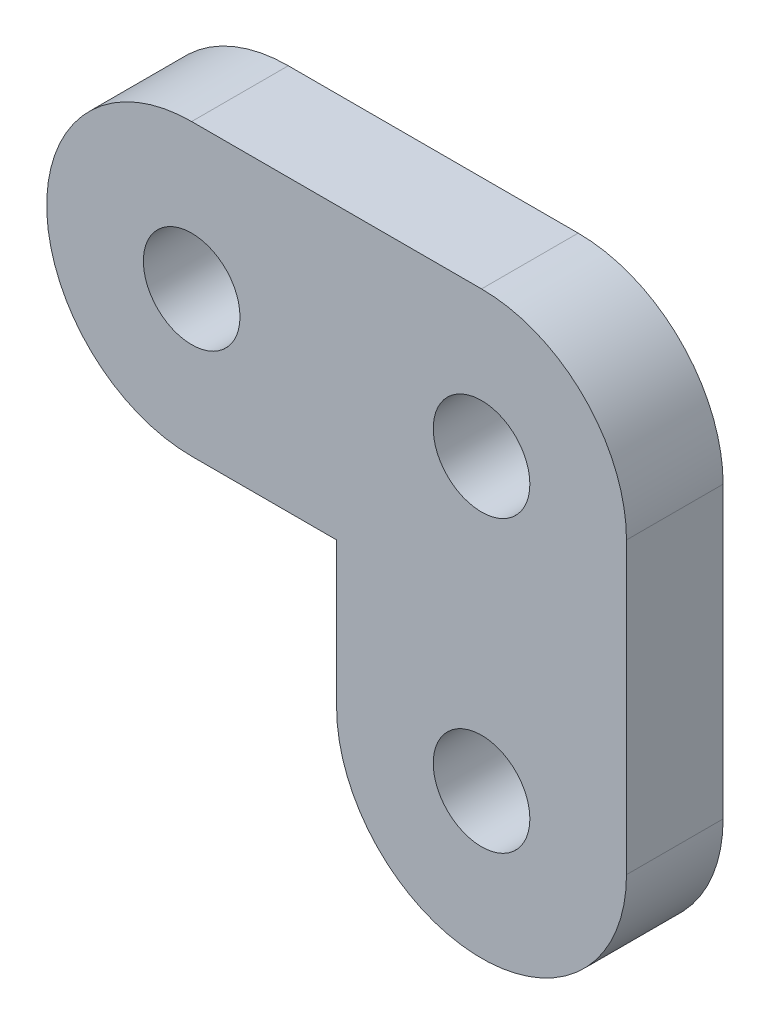
ISO-10303-21;
HEADER;
FILE_DESCRIPTION(('STEP AP214'),'2;1');
FILE_NAME('part.step','',(''),(''),'','','');
FILE_SCHEMA(('AUTOMOTIVE_DESIGN { 1 0 10303 214 1 1 1 1 }'));
ENDSEC;
DATA;
#1=APPLICATION_CONTEXT('core data for automotive mechanical design processes');
#2=APPLICATION_PROTOCOL_DEFINITION('international standard','automotive_design',2000,#1);
#3=PRODUCT_CONTEXT('',#1,'mechanical');
#4=PRODUCT('Part','Part','',(#3));
#5=PRODUCT_RELATED_PRODUCT_CATEGORY('part','',(#4));
#6=PRODUCT_DEFINITION_FORMATION('','',#4);
#7=PRODUCT_DEFINITION_CONTEXT('part definition',#1,'design');
#8=PRODUCT_DEFINITION('design','',#6,#7);
#9=PRODUCT_DEFINITION_SHAPE('','',#8);
#10=(LENGTH_UNIT() NAMED_UNIT(*) SI_UNIT(.MILLI.,.METRE.));
#11=(NAMED_UNIT(*) PLANE_ANGLE_UNIT() SI_UNIT($,.RADIAN.));
#12=(NAMED_UNIT(*) SI_UNIT($,.STERADIAN.) SOLID_ANGLE_UNIT());
#13=UNCERTAINTY_MEASURE_WITH_UNIT(LENGTH_MEASURE(1.E-05),#10,'distance_accuracy_value','');
#14=(GEOMETRIC_REPRESENTATION_CONTEXT(3) GLOBAL_UNCERTAINTY_ASSIGNED_CONTEXT((#13)) GLOBAL_UNIT_ASSIGNED_CONTEXT((#10,
#11,#12)) REPRESENTATION_CONTEXT('',''));
#15=CARTESIAN_POINT('',(0.,0.,0.));
#16=DIRECTION('',(0.,0.,1.));
#17=DIRECTION('',(1.,0.,0.));
#18=AXIS2_PLACEMENT_3D('',#15,#16,#17);
#19=CARTESIAN_POINT('',(149.3421335095,207.323953209,3.));
#20=DIRECTION('',(0.,0.,1.));
#21=DIRECTION('',(1.,0.,0.));
#22=AXIS2_PLACEMENT_3D('',#19,#20,#21);
#23=PLANE('',#22);
#24=CARTESIAN_POINT('',(158.3421335095,207.323953209,3.));
#25=DIRECTION('',(0.,0.,1.));
#26=DIRECTION('',(1.,0.,0.));
#27=AXIS2_PLACEMENT_3D('',#24,#25,#26);
#28=CIRCLE('',#27,1.5);
#29=CARTESIAN_POINT('',(159.8421335095,207.323953209,3.));
#30=VERTEX_POINT('',#29);
#31=EDGE_CURVE('E164',#30,#30,#28,.T.);
#32=ORIENTED_EDGE('',*,*,#31,.F.);
#33=EDGE_LOOP('',(#32));
#34=FACE_BOUND('',#33,.T.);
#35=CARTESIAN_POINT('',(149.3421335095,207.323953209,3.));
#36=DIRECTION('',(0.,0.,1.));
#37=DIRECTION('',(1.,0.,0.));
#38=AXIS2_PLACEMENT_3D('',#35,#36,#37);
#39=CIRCLE('',#38,4.49999999999999);
#40=CARTESIAN_POINT('',(149.3421335095,211.823953209,3.));
#41=VERTEX_POINT('',#40);
#42=CARTESIAN_POINT('',(149.3421335095,202.823953209,3.));
#43=VERTEX_POINT('',#42);
#44=EDGE_CURVE('E137',#41,#43,#39,.T.);
#45=ORIENTED_EDGE('',*,*,#44,.T.);
#46=DIRECTION('',(1.,0.,0.));
#47=VECTOR('',#46,1.);
#48=CARTESIAN_POINT('',(153.8421335095,202.823953209,3.));
#49=LINE('',#48,#47);
#50=CARTESIAN_POINT('',(153.8421335095,202.823953209,3.));
#51=VERTEX_POINT('',#50);
#52=EDGE_CURVE('E90',#43,#51,#49,.T.);
#53=ORIENTED_EDGE('',*,*,#52,.T.);
#54=DIRECTION('',(0.,-1.,0.));
#55=VECTOR('',#54,1.);
#56=CARTESIAN_POINT('',(153.8421335095,198.323953209,3.));
#57=LINE('',#56,#55);
#58=CARTESIAN_POINT('',(153.8421335095,198.323953209,3.));
#59=VERTEX_POINT('',#58);
#60=EDGE_CURVE('E149',#51,#59,#57,.T.);
#61=ORIENTED_EDGE('',*,*,#60,.T.);
#62=CARTESIAN_POINT('',(158.3421335095,198.323953209,3.));
#63=DIRECTION('',(0.,0.,1.));
#64=DIRECTION('',(1.,0.,0.));
#65=AXIS2_PLACEMENT_3D('',#62,#63,#64);
#66=CIRCLE('',#65,4.49999999999999);
#67=CARTESIAN_POINT('',(162.8421335095,198.323953209,3.));
#68=VERTEX_POINT('',#67);
#69=EDGE_CURVE('E106',#59,#68,#66,.T.);
#70=ORIENTED_EDGE('',*,*,#69,.T.);
#71=DIRECTION('',(0.,1.,0.));
#72=VECTOR('',#71,1.);
#73=CARTESIAN_POINT('',(162.8421335095,198.323953209,3.));
#74=LINE('',#73,#72);
#75=CARTESIAN_POINT('',(162.8421335095,207.323953209,3.));
#76=VERTEX_POINT('',#75);
#77=EDGE_CURVE('E100',#68,#76,#74,.T.);
#78=ORIENTED_EDGE('',*,*,#77,.T.);
#79=CARTESIAN_POINT('',(158.3421335095,207.323953209,3.));
#80=DIRECTION('',(0.,0.,1.));
#81=DIRECTION('',(1.,0.,0.));
#82=AXIS2_PLACEMENT_3D('',#79,#80,#81);
#83=CIRCLE('',#82,4.5);
#84=CARTESIAN_POINT('',(158.3421335095,211.823953209,3.));
#85=VERTEX_POINT('',#84);
#86=EDGE_CURVE('E104',#76,#85,#83,.T.);
#87=ORIENTED_EDGE('',*,*,#86,.T.);
#88=DIRECTION('',(-1.,0.,0.));
#89=VECTOR('',#88,1.);
#90=CARTESIAN_POINT('',(149.3421335095,211.823953209,3.));
#91=LINE('',#90,#89);
#92=EDGE_CURVE('E50',#85,#41,#91,.T.);
#93=ORIENTED_EDGE('',*,*,#92,.T.);
#94=EDGE_LOOP('',(#45,#53,#61,#70,#78,#87,#93));
#95=FACE_BOUND('',#94,.T.);
#96=CARTESIAN_POINT('',(149.3421335095,207.323953209,3.));
#97=DIRECTION('',(0.,0.,1.));
#98=DIRECTION('',(1.,0.,0.));
#99=AXIS2_PLACEMENT_3D('',#96,#97,#98);
#100=CIRCLE('',#99,1.5);
#101=CARTESIAN_POINT('',(150.8421335095,207.323953209,3.));
#102=VERTEX_POINT('',#101);
#103=EDGE_CURVE('E128',#102,#102,#100,.T.);
#104=ORIENTED_EDGE('',*,*,#103,.F.);
#105=EDGE_LOOP('',(#104));
#106=FACE_BOUND('',#105,.T.);
#107=CARTESIAN_POINT('',(158.3421335095,198.323953209,3.));
#108=DIRECTION('',(0.,0.,1.));
#109=DIRECTION('',(1.,0.,0.));
#110=AXIS2_PLACEMENT_3D('',#107,#108,#109);
#111=CIRCLE('',#110,1.5);
#112=CARTESIAN_POINT('',(159.8421335095,198.323953209,3.));
#113=VERTEX_POINT('',#112);
#114=EDGE_CURVE('E170',#113,#113,#111,.T.);
#115=ORIENTED_EDGE('',*,*,#114,.F.);
#116=EDGE_LOOP('',(#115));
#117=FACE_BOUND('',#116,.T.);
#118=ADVANCED_FACE('F33',(#34,#95,#106,#117),#23,.T.);
#119=CARTESIAN_POINT('',(149.3421335095,207.323953209,0.));
#120=DIRECTION('',(0.,0.,1.));
#121=DIRECTION('',(1.,0.,0.));
#122=AXIS2_PLACEMENT_3D('',#119,#120,#121);
#123=PLANE('',#122);
#124=CARTESIAN_POINT('',(158.3421335095,207.323953209,0.));
#125=DIRECTION('',(0.,0.,1.));
#126=DIRECTION('',(1.,0.,0.));
#127=AXIS2_PLACEMENT_3D('',#124,#125,#126);
#128=CIRCLE('',#127,1.5);
#129=CARTESIAN_POINT('',(159.8421335095,207.323953209,0.));
#130=VERTEX_POINT('',#129);
#131=EDGE_CURVE('E167',#130,#130,#128,.T.);
#132=ORIENTED_EDGE('',*,*,#131,.T.);
#133=EDGE_LOOP('',(#132));
#134=FACE_BOUND('',#133,.T.);
#135=CARTESIAN_POINT('',(149.3421335095,207.323953209,0.));
#136=DIRECTION('',(0.,0.,1.));
#137=DIRECTION('',(1.,0.,0.));
#138=AXIS2_PLACEMENT_3D('',#135,#136,#137);
#139=CIRCLE('',#138,4.49999999999999);
#140=CARTESIAN_POINT('',(149.3421335095,211.823953209,0.));
#141=VERTEX_POINT('',#140);
#142=CARTESIAN_POINT('',(149.3421335095,202.823953209,0.));
#143=VERTEX_POINT('',#142);
#144=EDGE_CURVE('E124',#141,#143,#139,.T.);
#145=ORIENTED_EDGE('',*,*,#144,.F.);
#146=DIRECTION('',(-1.,0.,0.));
#147=VECTOR('',#146,1.);
#148=CARTESIAN_POINT('',(149.3421335095,211.823953209,0.));
#149=LINE('',#148,#147);
#150=CARTESIAN_POINT('',(158.3421335095,211.823953209,0.));
#151=VERTEX_POINT('',#150);
#152=EDGE_CURVE('E82',#151,#141,#149,.T.);
#153=ORIENTED_EDGE('',*,*,#152,.F.);
#154=CARTESIAN_POINT('',(158.3421335095,207.323953209,0.));
#155=DIRECTION('',(0.,0.,1.));
#156=DIRECTION('',(1.,0.,0.));
#157=AXIS2_PLACEMENT_3D('',#154,#155,#156);
#158=CIRCLE('',#157,4.5);
#159=CARTESIAN_POINT('',(162.8421335095,207.323953209,0.));
#160=VERTEX_POINT('',#159);
#161=EDGE_CURVE('E76',#160,#151,#158,.T.);
#162=ORIENTED_EDGE('',*,*,#161,.F.);
#163=DIRECTION('',(0.,1.,0.));
#164=VECTOR('',#163,1.);
#165=CARTESIAN_POINT('',(162.8421335095,198.323953209,0.));
#166=LINE('',#165,#164);
#167=CARTESIAN_POINT('',(162.8421335095,198.323953209,0.));
#168=VERTEX_POINT('',#167);
#169=EDGE_CURVE('E114',#168,#160,#166,.T.);
#170=ORIENTED_EDGE('',*,*,#169,.F.);
#171=CARTESIAN_POINT('',(158.3421335095,198.323953209,0.));
#172=DIRECTION('',(0.,0.,1.));
#173=DIRECTION('',(1.,0.,0.));
#174=AXIS2_PLACEMENT_3D('',#171,#172,#173);
#175=CIRCLE('',#174,4.49999999999999);
#176=CARTESIAN_POINT('',(153.8421335095,198.323953209,0.));
#177=VERTEX_POINT('',#176);
#178=EDGE_CURVE('E132',#177,#168,#175,.T.);
#179=ORIENTED_EDGE('',*,*,#178,.F.);
#180=DIRECTION('',(0.,-1.,0.));
#181=VECTOR('',#180,1.);
#182=CARTESIAN_POINT('',(153.8421335095,198.323953209,0.));
#183=LINE('',#182,#181);
#184=CARTESIAN_POINT('',(153.8421335095,202.823953209,0.));
#185=VERTEX_POINT('',#184);
#186=EDGE_CURVE('E130',#185,#177,#183,.T.);
#187=ORIENTED_EDGE('',*,*,#186,.F.);
#188=DIRECTION('',(1.,0.,0.));
#189=VECTOR('',#188,1.);
#190=CARTESIAN_POINT('',(153.8421335095,202.823953209,0.));
#191=LINE('',#190,#189);
#192=EDGE_CURVE('E127',#143,#185,#191,.T.);
#193=ORIENTED_EDGE('',*,*,#192,.F.);
#194=EDGE_LOOP('',(#145,#153,#162,#170,#179,#187,#193));
#195=FACE_BOUND('',#194,.T.);
#196=CARTESIAN_POINT('',(149.3421335095,207.323953209,0.));
#197=DIRECTION('',(0.,0.,1.));
#198=DIRECTION('',(1.,0.,0.));
#199=AXIS2_PLACEMENT_3D('',#196,#197,#198);
#200=CIRCLE('',#199,1.5);
#201=CARTESIAN_POINT('',(150.8421335095,207.323953209,0.));
#202=VERTEX_POINT('',#201);
#203=EDGE_CURVE('E161',#202,#202,#200,.T.);
#204=ORIENTED_EDGE('',*,*,#203,.T.);
#205=EDGE_LOOP('',(#204));
#206=FACE_BOUND('',#205,.T.);
#207=CARTESIAN_POINT('',(158.3421335095,198.323953209,0.));
#208=DIRECTION('',(0.,0.,1.));
#209=DIRECTION('',(1.,0.,0.));
#210=AXIS2_PLACEMENT_3D('',#207,#208,#209);
#211=CIRCLE('',#210,1.5);
#212=CARTESIAN_POINT('',(159.8421335095,198.323953209,0.));
#213=VERTEX_POINT('',#212);
#214=EDGE_CURVE('E173',#213,#213,#211,.T.);
#215=ORIENTED_EDGE('',*,*,#214,.T.);
#216=EDGE_LOOP('',(#215));
#217=FACE_BOUND('',#216,.T.);
#218=ADVANCED_FACE('F153',(#134,#195,#206,#217),#123,.F.);
#219=CARTESIAN_POINT('',(149.3421335095,207.323953209,3.));
#220=DIRECTION('',(0.,0.,-1.));
#221=DIRECTION('',(-1.,0.,0.));
#222=AXIS2_PLACEMENT_3D('',#219,#220,#221);
#223=CYLINDRICAL_SURFACE('',#222,4.49999999999999);
#224=ORIENTED_EDGE('',*,*,#144,.T.);
#225=DIRECTION('',(0.,0.,-1.));
#226=VECTOR('',#225,1.);
#227=CARTESIAN_POINT('',(149.3421335095,202.823953209,3.));
#228=LINE('',#227,#226);
#229=EDGE_CURVE('E11',#43,#143,#228,.T.);
#230=ORIENTED_EDGE('',*,*,#229,.F.);
#231=ORIENTED_EDGE('',*,*,#44,.F.);
#232=DIRECTION('',(0.,0.,-1.));
#233=VECTOR('',#232,1.);
#234=CARTESIAN_POINT('',(149.3421335095,211.823953209,3.));
#235=LINE('',#234,#233);
#236=EDGE_CURVE('E120',#41,#141,#235,.T.);
#237=ORIENTED_EDGE('',*,*,#236,.T.);
#238=EDGE_LOOP('',(#224,#230,#231,#237));
#239=FACE_BOUND('',#238,.T.);
#240=ADVANCED_FACE('F35',(#239),#223,.T.);
#241=CARTESIAN_POINT('',(153.8421335095,202.823953209,3.));
#242=DIRECTION('',(0.,1.,0.));
#243=DIRECTION('',(0.,0.,1.));
#244=AXIS2_PLACEMENT_3D('',#241,#242,#243);
#245=PLANE('',#244);
#246=ORIENTED_EDGE('',*,*,#192,.T.);
#247=DIRECTION('',(0.,0.,-1.));
#248=VECTOR('',#247,1.);
#249=CARTESIAN_POINT('',(153.8421335095,202.823953209,3.));
#250=LINE('',#249,#248);
#251=EDGE_CURVE('E42',#51,#185,#250,.T.);
#252=ORIENTED_EDGE('',*,*,#251,.F.);
#253=ORIENTED_EDGE('',*,*,#52,.F.);
#254=ORIENTED_EDGE('',*,*,#229,.T.);
#255=EDGE_LOOP('',(#246,#252,#253,#254));
#256=FACE_BOUND('',#255,.T.);
#257=ADVANCED_FACE('F205',(#256),#245,.F.);
#258=CARTESIAN_POINT('',(153.8421335095,198.323953209,3.));
#259=DIRECTION('',(1.,0.,0.));
#260=DIRECTION('',(0.,0.,-1.));
#261=AXIS2_PLACEMENT_3D('',#258,#259,#260);
#262=PLANE('',#261);
#263=ORIENTED_EDGE('',*,*,#186,.T.);
#264=DIRECTION('',(0.,0.,-1.));
#265=VECTOR('',#264,1.);
#266=CARTESIAN_POINT('',(153.8421335095,198.323953209,3.));
#267=LINE('',#266,#265);
#268=EDGE_CURVE('E141',#59,#177,#267,.T.);
#269=ORIENTED_EDGE('',*,*,#268,.F.);
#270=ORIENTED_EDGE('',*,*,#60,.F.);
#271=ORIENTED_EDGE('',*,*,#251,.T.);
#272=EDGE_LOOP('',(#263,#269,#270,#271));
#273=FACE_BOUND('',#272,.T.);
#274=ADVANCED_FACE('F147',(#273),#262,.F.);
#275=CARTESIAN_POINT('',(158.3421335095,198.323953209,3.));
#276=DIRECTION('',(0.,0.,-1.));
#277=DIRECTION('',(-1.,0.,0.));
#278=AXIS2_PLACEMENT_3D('',#275,#276,#277);
#279=CYLINDRICAL_SURFACE('',#278,4.49999999999999);
#280=ORIENTED_EDGE('',*,*,#178,.T.);
#281=DIRECTION('',(0.,0.,-1.));
#282=VECTOR('',#281,1.);
#283=CARTESIAN_POINT('',(162.8421335095,198.323953209,3.));
#284=LINE('',#283,#282);
#285=EDGE_CURVE('E115',#68,#168,#284,.T.);
#286=ORIENTED_EDGE('',*,*,#285,.F.);
#287=ORIENTED_EDGE('',*,*,#69,.F.);
#288=ORIENTED_EDGE('',*,*,#268,.T.);
#289=EDGE_LOOP('',(#280,#286,#287,#288));
#290=FACE_BOUND('',#289,.T.);
#291=ADVANCED_FACE('F156',(#290),#279,.T.);
#292=CARTESIAN_POINT('',(162.8421335095,198.323953209,3.));
#293=DIRECTION('',(-1.,0.,0.));
#294=DIRECTION('',(0.,0.,1.));
#295=AXIS2_PLACEMENT_3D('',#292,#293,#294);
#296=PLANE('',#295);
#297=ORIENTED_EDGE('',*,*,#169,.T.);
#298=DIRECTION('',(0.,0.,-1.));
#299=VECTOR('',#298,1.);
#300=CARTESIAN_POINT('',(162.8421335095,207.323953209,3.));
#301=LINE('',#300,#299);
#302=EDGE_CURVE('E111',#76,#160,#301,.T.);
#303=ORIENTED_EDGE('',*,*,#302,.F.);
#304=ORIENTED_EDGE('',*,*,#77,.F.);
#305=ORIENTED_EDGE('',*,*,#285,.T.);
#306=EDGE_LOOP('',(#297,#303,#304,#305));
#307=FACE_BOUND('',#306,.T.);
#308=ADVANCED_FACE('F112',(#307),#296,.F.);
#309=CARTESIAN_POINT('',(158.3421335095,207.323953209,3.));
#310=DIRECTION('',(0.,0.,-1.));
#311=DIRECTION('',(-1.,0.,0.));
#312=AXIS2_PLACEMENT_3D('',#309,#310,#311);
#313=CYLINDRICAL_SURFACE('',#312,4.5);
#314=ORIENTED_EDGE('',*,*,#161,.T.);
#315=DIRECTION('',(0.,0.,-1.));
#316=VECTOR('',#315,1.);
#317=CARTESIAN_POINT('',(158.3421335095,211.823953209,3.));
#318=LINE('',#317,#316);
#319=EDGE_CURVE('E116',#85,#151,#318,.T.);
#320=ORIENTED_EDGE('',*,*,#319,.F.);
#321=ORIENTED_EDGE('',*,*,#86,.F.);
#322=ORIENTED_EDGE('',*,*,#302,.T.);
#323=EDGE_LOOP('',(#314,#320,#321,#322));
#324=FACE_BOUND('',#323,.T.);
#325=ADVANCED_FACE('F118',(#324),#313,.T.);
#326=CARTESIAN_POINT('',(149.3421335095,211.823953209,3.));
#327=DIRECTION('',(0.,-1.,0.));
#328=DIRECTION('',(0.,0.,-1.));
#329=AXIS2_PLACEMENT_3D('',#326,#327,#328);
#330=PLANE('',#329);
#331=ORIENTED_EDGE('',*,*,#152,.T.);
#332=ORIENTED_EDGE('',*,*,#236,.F.);
#333=ORIENTED_EDGE('',*,*,#92,.F.);
#334=ORIENTED_EDGE('',*,*,#319,.T.);
#335=EDGE_LOOP('',(#331,#332,#333,#334));
#336=FACE_BOUND('',#335,.T.);
#337=ADVANCED_FACE('F195',(#336),#330,.F.);
#338=CARTESIAN_POINT('',(149.3421335095,207.323953209,3.));
#339=DIRECTION('',(0.,0.,-1.));
#340=DIRECTION('',(-1.,0.,0.));
#341=AXIS2_PLACEMENT_3D('',#338,#339,#340);
#342=CYLINDRICAL_SURFACE('',#341,1.5);
#343=ORIENTED_EDGE('',*,*,#103,.T.);
#344=EDGE_LOOP('',(#343));
#345=FACE_BOUND('',#344,.T.);
#346=ORIENTED_EDGE('',*,*,#203,.F.);
#347=EDGE_LOOP('',(#346));
#348=FACE_BOUND('',#347,.T.);
#349=ADVANCED_FACE('F192',(#345,#348),#342,.F.);
#350=CARTESIAN_POINT('',(158.3421335095,207.323953209,3.));
#351=DIRECTION('',(0.,0.,-1.));
#352=DIRECTION('',(-1.,0.,0.));
#353=AXIS2_PLACEMENT_3D('',#350,#351,#352);
#354=CYLINDRICAL_SURFACE('',#353,1.5);
#355=ORIENTED_EDGE('',*,*,#31,.T.);
#356=EDGE_LOOP('',(#355));
#357=FACE_BOUND('',#356,.T.);
#358=ORIENTED_EDGE('',*,*,#131,.F.);
#359=EDGE_LOOP('',(#358));
#360=FACE_BOUND('',#359,.T.);
#361=ADVANCED_FACE('F264',(#357,#360),#354,.F.);
#362=CARTESIAN_POINT('',(158.3421335095,198.323953209,3.));
#363=DIRECTION('',(0.,0.,-1.));
#364=DIRECTION('',(-1.,0.,0.));
#365=AXIS2_PLACEMENT_3D('',#362,#363,#364);
#366=CYLINDRICAL_SURFACE('',#365,1.5);
#367=ORIENTED_EDGE('',*,*,#114,.T.);
#368=EDGE_LOOP('',(#367));
#369=FACE_BOUND('',#368,.T.);
#370=ORIENTED_EDGE('',*,*,#214,.F.);
#371=EDGE_LOOP('',(#370));
#372=FACE_BOUND('',#371,.T.);
#373=ADVANCED_FACE('F179',(#369,#372),#366,.F.);
#374=CLOSED_SHELL('',(#118,#218,#240,#257,#274,#291,#308,#325,#337,#349,#361,#373));
#375=MANIFOLD_SOLID_BREP('B2',#374);
#376=ADVANCED_BREP_SHAPE_REPRESENTATION('',(#18,#375),#14);
#377=SHAPE_DEFINITION_REPRESENTATION(#9,#376);
ENDSEC;
END-ISO-10303-21;
